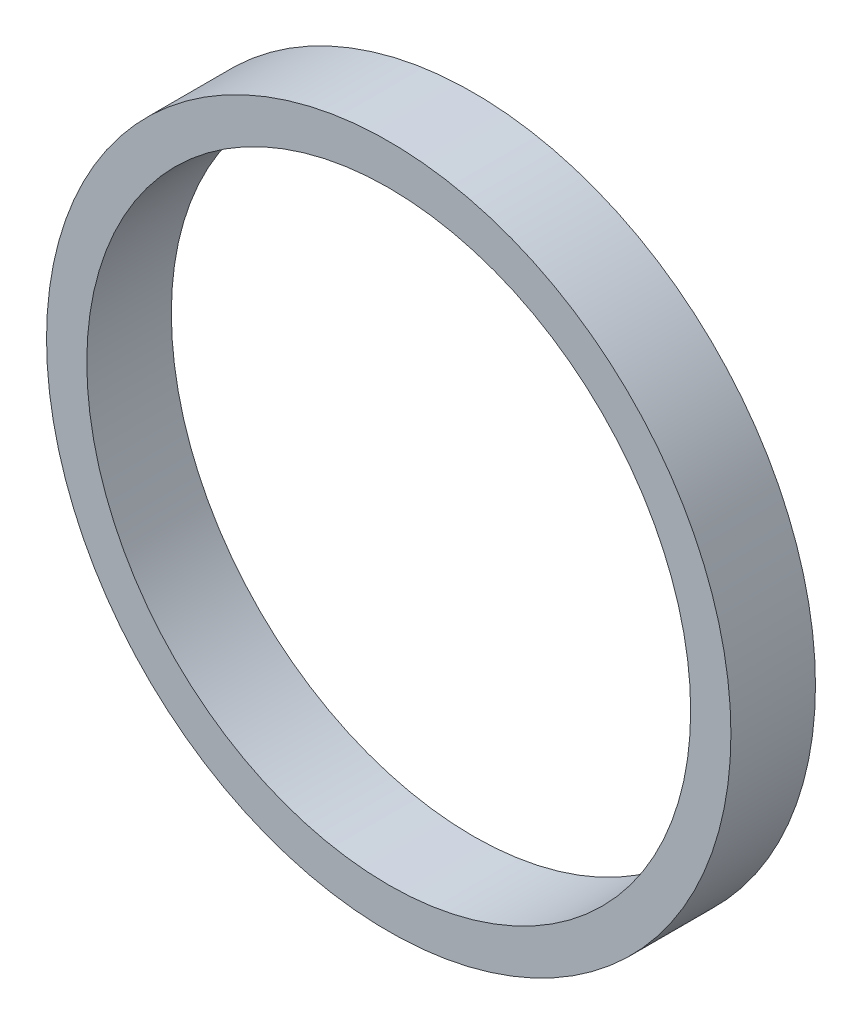
ISO-10303-21;
HEADER;
FILE_DESCRIPTION(('STEP AP214'),'2;1');
FILE_NAME('part.step','',(''),(''),'','','');
FILE_SCHEMA(('AUTOMOTIVE_DESIGN { 1 0 10303 214 1 1 1 1 }'));
ENDSEC;
DATA;
#1=APPLICATION_CONTEXT('core data for automotive mechanical design processes');
#2=APPLICATION_PROTOCOL_DEFINITION('international standard','automotive_design',2000,#1);
#3=PRODUCT_CONTEXT('',#1,'mechanical');
#4=PRODUCT('Part','Part','',(#3));
#5=PRODUCT_RELATED_PRODUCT_CATEGORY('part','',(#4));
#6=PRODUCT_DEFINITION_FORMATION('','',#4);
#7=PRODUCT_DEFINITION_CONTEXT('part definition',#1,'design');
#8=PRODUCT_DEFINITION('design','',#6,#7);
#9=PRODUCT_DEFINITION_SHAPE('','',#8);
#10=(LENGTH_UNIT() NAMED_UNIT(*) SI_UNIT(.MILLI.,.METRE.));
#11=(NAMED_UNIT(*) PLANE_ANGLE_UNIT() SI_UNIT($,.RADIAN.));
#12=(NAMED_UNIT(*) SI_UNIT($,.STERADIAN.) SOLID_ANGLE_UNIT());
#13=UNCERTAINTY_MEASURE_WITH_UNIT(LENGTH_MEASURE(1.E-05),#10,'distance_accuracy_value','');
#14=(GEOMETRIC_REPRESENTATION_CONTEXT(3) GLOBAL_UNCERTAINTY_ASSIGNED_CONTEXT((#13)) GLOBAL_UNIT_ASSIGNED_CONTEXT((#10,
#11,#12)) REPRESENTATION_CONTEXT('',''));
#15=CARTESIAN_POINT('',(0.,0.,0.));
#16=DIRECTION('',(0.,0.,1.));
#17=DIRECTION('',(1.,0.,0.));
#18=AXIS2_PLACEMENT_3D('',#15,#16,#17);
#19=CARTESIAN_POINT('',(0.,0.,2.1));
#20=DIRECTION('',(0.,0.,1.));
#21=DIRECTION('',(1.,0.,0.));
#22=AXIS2_PLACEMENT_3D('',#19,#20,#21);
#23=PLANE('',#22);
#24=CARTESIAN_POINT('',(0.,0.,2.1));
#25=DIRECTION('',(0.,0.,1.));
#26=DIRECTION('',(1.,0.,0.));
#27=AXIS2_PLACEMENT_3D('',#24,#25,#26);
#28=CIRCLE('',#27,8.5);
#29=CARTESIAN_POINT('',(8.5,0.,2.1));
#30=VERTEX_POINT('',#29);
#31=EDGE_CURVE('E10',#30,#30,#28,.T.);
#32=ORIENTED_EDGE('',*,*,#31,.T.);
#33=EDGE_LOOP('',(#32));
#34=FACE_BOUND('',#33,.T.);
#35=CARTESIAN_POINT('',(0.,0.,2.1));
#36=DIRECTION('',(0.,0.,1.));
#37=DIRECTION('',(1.,0.,0.));
#38=AXIS2_PLACEMENT_3D('',#35,#36,#37);
#39=CIRCLE('',#38,7.5);
#40=CARTESIAN_POINT('',(7.5,0.,2.1));
#41=VERTEX_POINT('',#40);
#42=EDGE_CURVE('E42',#41,#41,#39,.T.);
#43=ORIENTED_EDGE('',*,*,#42,.F.);
#44=EDGE_LOOP('',(#43));
#45=FACE_BOUND('',#44,.T.);
#46=ADVANCED_FACE('F31',(#34,#45),#23,.T.);
#47=CARTESIAN_POINT('',(0.,0.,0.));
#48=DIRECTION('',(0.,0.,1.));
#49=DIRECTION('',(1.,0.,0.));
#50=AXIS2_PLACEMENT_3D('',#47,#48,#49);
#51=PLANE('',#50);
#52=CARTESIAN_POINT('',(0.,0.,0.));
#53=DIRECTION('',(0.,0.,1.));
#54=DIRECTION('',(1.,0.,0.));
#55=AXIS2_PLACEMENT_3D('',#52,#53,#54);
#56=CIRCLE('',#55,8.5);
#57=CARTESIAN_POINT('',(8.5,0.,0.));
#58=VERTEX_POINT('',#57);
#59=EDGE_CURVE('E35',#58,#58,#56,.T.);
#60=ORIENTED_EDGE('',*,*,#59,.F.);
#61=EDGE_LOOP('',(#60));
#62=FACE_BOUND('',#61,.T.);
#63=CARTESIAN_POINT('',(0.,0.,0.));
#64=DIRECTION('',(0.,0.,1.));
#65=DIRECTION('',(1.,0.,0.));
#66=AXIS2_PLACEMENT_3D('',#63,#64,#65);
#67=CIRCLE('',#66,7.5);
#68=CARTESIAN_POINT('',(7.5,0.,0.));
#69=VERTEX_POINT('',#68);
#70=EDGE_CURVE('E44',#69,#69,#67,.T.);
#71=ORIENTED_EDGE('',*,*,#70,.T.);
#72=EDGE_LOOP('',(#71));
#73=FACE_BOUND('',#72,.T.);
#74=ADVANCED_FACE('F54',(#62,#73),#51,.F.);
#75=CARTESIAN_POINT('',(0.,0.,2.1));
#76=DIRECTION('',(0.,0.,-1.));
#77=DIRECTION('',(-1.,0.,0.));
#78=AXIS2_PLACEMENT_3D('',#75,#76,#77);
#79=CYLINDRICAL_SURFACE('',#78,8.5);
#80=ORIENTED_EDGE('',*,*,#31,.F.);
#81=EDGE_LOOP('',(#80));
#82=FACE_BOUND('',#81,.T.);
#83=ORIENTED_EDGE('',*,*,#59,.T.);
#84=EDGE_LOOP('',(#83));
#85=FACE_BOUND('',#84,.T.);
#86=ADVANCED_FACE('F33',(#82,#85),#79,.T.);
#87=CARTESIAN_POINT('',(0.,0.,2.1));
#88=DIRECTION('',(0.,0.,-1.));
#89=DIRECTION('',(-1.,0.,0.));
#90=AXIS2_PLACEMENT_3D('',#87,#88,#89);
#91=CYLINDRICAL_SURFACE('',#90,7.5);
#92=ORIENTED_EDGE('',*,*,#42,.T.);
#93=EDGE_LOOP('',(#92));
#94=FACE_BOUND('',#93,.T.);
#95=ORIENTED_EDGE('',*,*,#70,.F.);
#96=EDGE_LOOP('',(#95));
#97=FACE_BOUND('',#96,.T.);
#98=ADVANCED_FACE('F50',(#94,#97),#91,.F.);
#99=CLOSED_SHELL('',(#46,#74,#86,#98));
#100=MANIFOLD_SOLID_BREP('B2',#99);
#101=ADVANCED_BREP_SHAPE_REPRESENTATION('',(#18,#100),#14);
#102=SHAPE_DEFINITION_REPRESENTATION(#9,#101);
ENDSEC;
END-ISO-10303-21;
